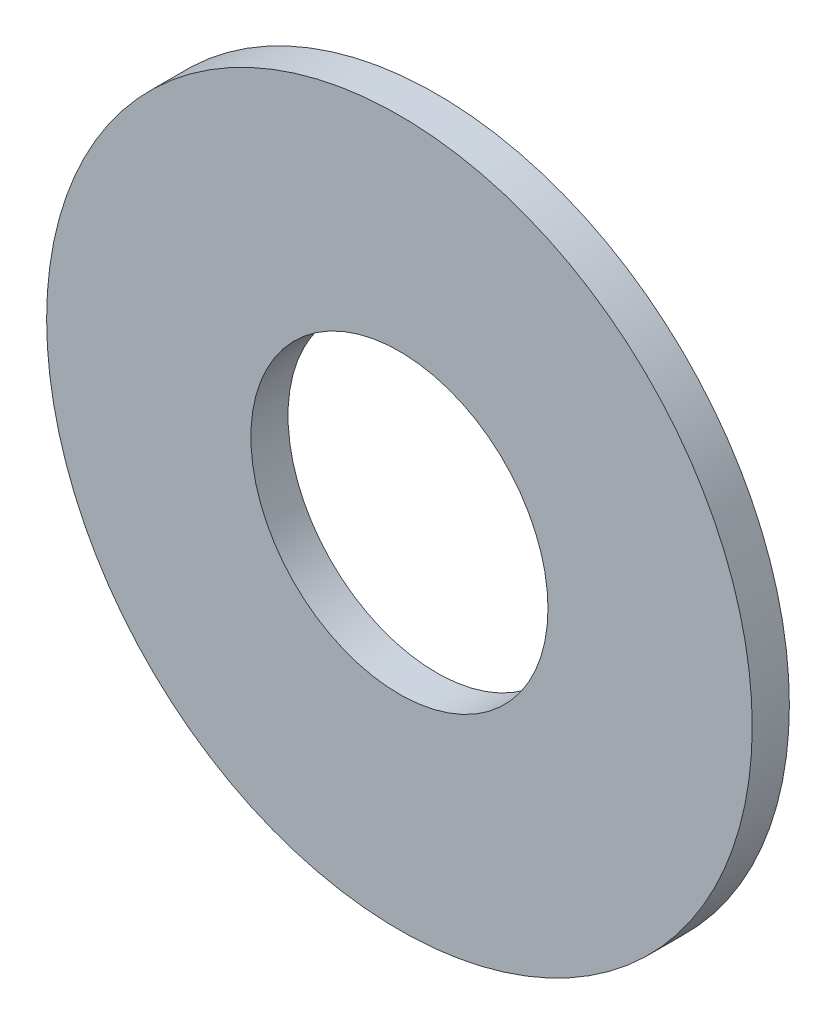
ISO-10303-21;
HEADER;
FILE_DESCRIPTION(('STEP AP214'),'2;1');
FILE_NAME('part.step','',(''),(''),'','','');
FILE_SCHEMA(('AUTOMOTIVE_DESIGN { 1 0 10303 214 1 1 1 1 }'));
ENDSEC;
DATA;
#1=APPLICATION_CONTEXT('core data for automotive mechanical design processes');
#2=APPLICATION_PROTOCOL_DEFINITION('international standard','automotive_design',2000,#1);
#3=PRODUCT_CONTEXT('',#1,'mechanical');
#4=PRODUCT('Part','Part','',(#3));
#5=PRODUCT_RELATED_PRODUCT_CATEGORY('part','',(#4));
#6=PRODUCT_DEFINITION_FORMATION('','',#4);
#7=PRODUCT_DEFINITION_CONTEXT('part definition',#1,'design');
#8=PRODUCT_DEFINITION('design','',#6,#7);
#9=PRODUCT_DEFINITION_SHAPE('','',#8);
#10=(LENGTH_UNIT() NAMED_UNIT(*) SI_UNIT(.MILLI.,.METRE.));
#11=(NAMED_UNIT(*) PLANE_ANGLE_UNIT() SI_UNIT($,.RADIAN.));
#12=(NAMED_UNIT(*) SI_UNIT($,.STERADIAN.) SOLID_ANGLE_UNIT());
#13=UNCERTAINTY_MEASURE_WITH_UNIT(LENGTH_MEASURE(1.E-05),#10,'distance_accuracy_value','');
#14=(GEOMETRIC_REPRESENTATION_CONTEXT(3) GLOBAL_UNCERTAINTY_ASSIGNED_CONTEXT((#13)) GLOBAL_UNIT_ASSIGNED_CONTEXT((#10,
#11,#12)) REPRESENTATION_CONTEXT('',''));
#15=CARTESIAN_POINT('',(0.,0.,0.));
#16=DIRECTION('',(0.,0.,1.));
#17=DIRECTION('',(1.,0.,0.));
#18=AXIS2_PLACEMENT_3D('',#15,#16,#17);
#19=CARTESIAN_POINT('',(0.,0.,1.));
#20=DIRECTION('',(0.,0.,1.));
#21=DIRECTION('',(1.,0.,0.));
#22=AXIS2_PLACEMENT_3D('',#19,#20,#21);
#23=PLANE('',#22);
#24=CARTESIAN_POINT('',(0.,0.,1.));
#25=DIRECTION('',(0.,0.,1.));
#26=DIRECTION('',(1.,0.,0.));
#27=AXIS2_PLACEMENT_3D('',#24,#25,#26);
#28=CIRCLE('',#27,9.5);
#29=CARTESIAN_POINT('',(9.5,0.,1.));
#30=VERTEX_POINT('',#29);
#31=EDGE_CURVE('E10',#30,#30,#28,.T.);
#32=ORIENTED_EDGE('',*,*,#31,.T.);
#33=EDGE_LOOP('',(#32));
#34=FACE_BOUND('',#33,.T.);
#35=CARTESIAN_POINT('',(0.,0.,1.));
#36=DIRECTION('',(0.,0.,1.));
#37=DIRECTION('',(1.,0.,0.));
#38=AXIS2_PLACEMENT_3D('',#35,#36,#37);
#39=CIRCLE('',#38,4.);
#40=CARTESIAN_POINT('',(4.,0.,1.));
#41=VERTEX_POINT('',#40);
#42=EDGE_CURVE('E50',#41,#41,#39,.T.);
#43=ORIENTED_EDGE('',*,*,#42,.F.);
#44=EDGE_LOOP('',(#43));
#45=FACE_BOUND('',#44,.T.);
#46=ADVANCED_FACE('F37',(#34,#45),#23,.T.);
#47=CARTESIAN_POINT('',(0.,0.,0.));
#48=DIRECTION('',(0.,0.,1.));
#49=DIRECTION('',(1.,0.,0.));
#50=AXIS2_PLACEMENT_3D('',#47,#48,#49);
#51=PLANE('',#50);
#52=CARTESIAN_POINT('',(0.,0.,0.));
#53=DIRECTION('',(0.,0.,1.));
#54=DIRECTION('',(1.,0.,0.));
#55=AXIS2_PLACEMENT_3D('',#52,#53,#54);
#56=CIRCLE('',#55,9.5);
#57=CARTESIAN_POINT('',(9.5,0.,0.));
#58=VERTEX_POINT('',#57);
#59=EDGE_CURVE('E41',#58,#58,#56,.T.);
#60=ORIENTED_EDGE('',*,*,#59,.F.);
#61=EDGE_LOOP('',(#60));
#62=FACE_BOUND('',#61,.T.);
#63=CARTESIAN_POINT('',(0.,0.,0.));
#64=DIRECTION('',(0.,0.,1.));
#65=DIRECTION('',(1.,0.,0.));
#66=AXIS2_PLACEMENT_3D('',#63,#64,#65);
#67=CIRCLE('',#66,4.);
#68=CARTESIAN_POINT('',(4.,0.,0.));
#69=VERTEX_POINT('',#68);
#70=EDGE_CURVE('E52',#69,#69,#67,.T.);
#71=ORIENTED_EDGE('',*,*,#70,.T.);
#72=EDGE_LOOP('',(#71));
#73=FACE_BOUND('',#72,.T.);
#74=ADVANCED_FACE('F64',(#62,#73),#51,.F.);
#75=CARTESIAN_POINT('',(0.,0.,1.));
#76=DIRECTION('',(0.,0.,-1.));
#77=DIRECTION('',(-1.,0.,0.));
#78=AXIS2_PLACEMENT_3D('',#75,#76,#77);
#79=CYLINDRICAL_SURFACE('',#78,9.5);
#80=ORIENTED_EDGE('',*,*,#31,.F.);
#81=EDGE_LOOP('',(#80));
#82=FACE_BOUND('',#81,.T.);
#83=ORIENTED_EDGE('',*,*,#59,.T.);
#84=EDGE_LOOP('',(#83));
#85=FACE_BOUND('',#84,.T.);
#86=ADVANCED_FACE('F39',(#82,#85),#79,.T.);
#87=CARTESIAN_POINT('',(0.,0.,1.));
#88=DIRECTION('',(0.,0.,-1.));
#89=DIRECTION('',(-1.,0.,0.));
#90=AXIS2_PLACEMENT_3D('',#87,#88,#89);
#91=CYLINDRICAL_SURFACE('',#90,4.);
#92=ORIENTED_EDGE('',*,*,#42,.T.);
#93=EDGE_LOOP('',(#92));
#94=FACE_BOUND('',#93,.T.);
#95=ORIENTED_EDGE('',*,*,#70,.F.);
#96=EDGE_LOOP('',(#95));
#97=FACE_BOUND('',#96,.T.);
#98=ADVANCED_FACE('F60',(#94,#97),#91,.F.);
#99=CLOSED_SHELL('',(#46,#74,#86,#98));
#100=MANIFOLD_SOLID_BREP('B2',#99);
#101=ADVANCED_BREP_SHAPE_REPRESENTATION('',(#18,#100),#14);
#102=SHAPE_DEFINITION_REPRESENTATION(#9,#101);
ENDSEC;
END-ISO-10303-21;
